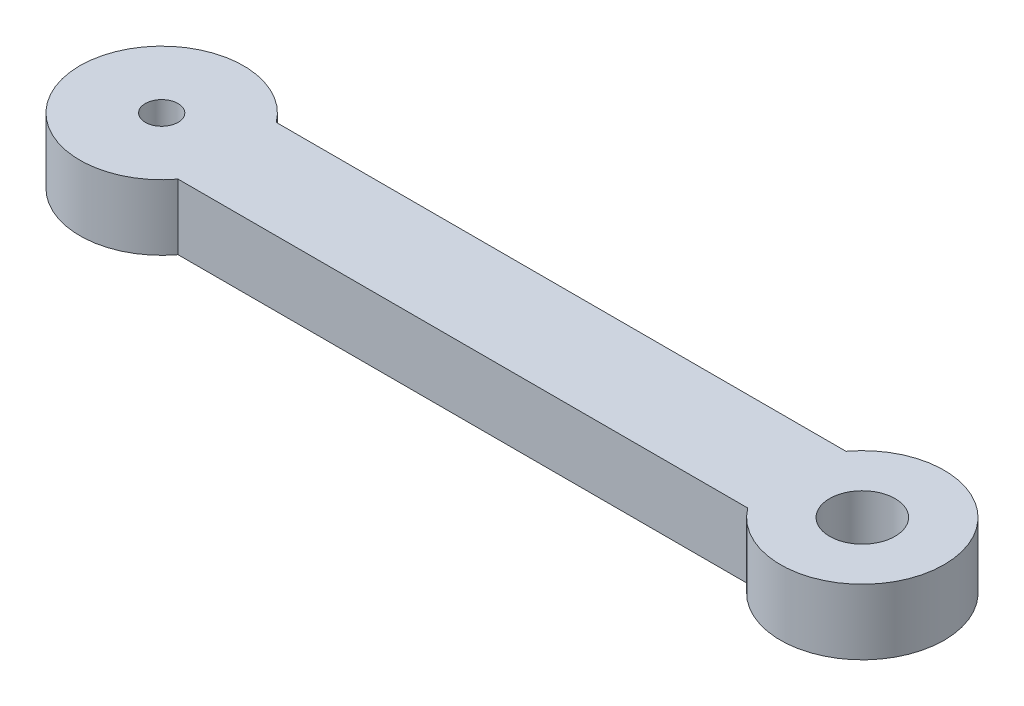
ISO-10303-21;
HEADER;
FILE_DESCRIPTION(('STEP AP214'),'2;1');
FILE_NAME('part.step','',(''),(''),'','','');
FILE_SCHEMA(('AUTOMOTIVE_DESIGN { 1 0 10303 214 1 1 1 1 }'));
ENDSEC;
DATA;
#1=APPLICATION_CONTEXT('core data for automotive mechanical design processes');
#2=APPLICATION_PROTOCOL_DEFINITION('international standard','automotive_design',2000,#1);
#3=PRODUCT_CONTEXT('',#1,'mechanical');
#4=PRODUCT('Part','Part','',(#3));
#5=PRODUCT_RELATED_PRODUCT_CATEGORY('part','',(#4));
#6=PRODUCT_DEFINITION_FORMATION('','',#4);
#7=PRODUCT_DEFINITION_CONTEXT('part definition',#1,'design');
#8=PRODUCT_DEFINITION('design','',#6,#7);
#9=PRODUCT_DEFINITION_SHAPE('','',#8);
#10=(LENGTH_UNIT() NAMED_UNIT(*) SI_UNIT(.MILLI.,.METRE.));
#11=(NAMED_UNIT(*) PLANE_ANGLE_UNIT() SI_UNIT($,.RADIAN.));
#12=(NAMED_UNIT(*) SI_UNIT($,.STERADIAN.) SOLID_ANGLE_UNIT());
#13=UNCERTAINTY_MEASURE_WITH_UNIT(LENGTH_MEASURE(1.E-05),#10,'distance_accuracy_value','');
#14=(GEOMETRIC_REPRESENTATION_CONTEXT(3) GLOBAL_UNCERTAINTY_ASSIGNED_CONTEXT((#13)) GLOBAL_UNIT_ASSIGNED_CONTEXT((#10,
#11,#12)) REPRESENTATION_CONTEXT('',''));
#15=CARTESIAN_POINT('',(0.,0.,0.));
#16=DIRECTION('',(0.,0.,1.));
#17=DIRECTION('',(1.,0.,0.));
#18=AXIS2_PLACEMENT_3D('',#15,#16,#17);
#19=CARTESIAN_POINT('',(-10.7,2.,0.));
#20=DIRECTION('',(0.,1.,0.));
#21=DIRECTION('',(0.,0.,1.));
#22=AXIS2_PLACEMENT_3D('',#19,#20,#21);
#23=PLANE('',#22);
#24=CARTESIAN_POINT('',(-10.7,2.,0.));
#25=DIRECTION('',(0.,1.,0.));
#26=DIRECTION('',(0.,0.,1.));
#27=AXIS2_PLACEMENT_3D('',#24,#25,#26);
#28=CIRCLE('',#27,0.500000000000001);
#29=CARTESIAN_POINT('',(-10.7,2.,0.500000000000001));
#30=VERTEX_POINT('',#29);
#31=EDGE_CURVE('E103',#30,#30,#28,.T.);
#32=ORIENTED_EDGE('',*,*,#31,.F.);
#33=EDGE_LOOP('',(#32));
#34=FACE_BOUND('',#33,.T.);
#35=CARTESIAN_POINT('',(-10.7,2.,0.));
#36=DIRECTION('',(0.,1.,0.));
#37=DIRECTION('',(0.,0.,1.));
#38=AXIS2_PLACEMENT_3D('',#35,#36,#37);
#39=CIRCLE('',#38,2.5);
#40=CARTESIAN_POINT('',(-8.7,2.,-1.5));
#41=VERTEX_POINT('',#40);
#42=CARTESIAN_POINT('',(-8.7,2.,1.5));
#43=VERTEX_POINT('',#42);
#44=EDGE_CURVE('E88',#41,#43,#39,.T.);
#45=ORIENTED_EDGE('',*,*,#44,.T.);
#46=DIRECTION('',(1.,0.,0.));
#47=VECTOR('',#46,1.);
#48=CARTESIAN_POINT('',(-8.7,2.,1.5));
#49=LINE('',#48,#47);
#50=CARTESIAN_POINT('',(8.7,2.,1.5));
#51=VERTEX_POINT('',#50);
#52=EDGE_CURVE('E83',#43,#51,#49,.T.);
#53=ORIENTED_EDGE('',*,*,#52,.T.);
#54=CARTESIAN_POINT('',(10.7,2.,0.));
#55=DIRECTION('',(0.,1.,0.));
#56=DIRECTION('',(0.,0.,1.));
#57=AXIS2_PLACEMENT_3D('',#54,#55,#56);
#58=CIRCLE('',#57,2.5);
#59=CARTESIAN_POINT('',(8.7,2.,-1.5));
#60=VERTEX_POINT('',#59);
#61=EDGE_CURVE('E86',#51,#60,#58,.T.);
#62=ORIENTED_EDGE('',*,*,#61,.T.);
#63=DIRECTION('',(-1.,0.,0.));
#64=VECTOR('',#63,1.);
#65=CARTESIAN_POINT('',(-8.7,2.,-1.5));
#66=LINE('',#65,#64);
#67=EDGE_CURVE('E53',#60,#41,#66,.T.);
#68=ORIENTED_EDGE('',*,*,#67,.T.);
#69=EDGE_LOOP('',(#45,#53,#62,#68));
#70=FACE_BOUND('',#69,.T.);
#71=CARTESIAN_POINT('',(10.7,2.,0.));
#72=DIRECTION('',(0.,1.,0.));
#73=DIRECTION('',(0.,0.,1.));
#74=AXIS2_PLACEMENT_3D('',#71,#72,#73);
#75=CIRCLE('',#74,1.);
#76=CARTESIAN_POINT('',(10.7,2.,1.));
#77=VERTEX_POINT('',#76);
#78=EDGE_CURVE('E118',#77,#77,#75,.T.);
#79=ORIENTED_EDGE('',*,*,#78,.F.);
#80=EDGE_LOOP('',(#79));
#81=FACE_BOUND('',#80,.T.);
#82=ADVANCED_FACE('F36',(#34,#70,#81),#23,.T.);
#83=CARTESIAN_POINT('',(-10.7,0.,0.));
#84=DIRECTION('',(0.,1.,0.));
#85=DIRECTION('',(0.,0.,1.));
#86=AXIS2_PLACEMENT_3D('',#83,#84,#85);
#87=PLANE('',#86);
#88=CARTESIAN_POINT('',(-10.7,0.,0.));
#89=DIRECTION('',(0.,1.,0.));
#90=DIRECTION('',(0.,0.,1.));
#91=AXIS2_PLACEMENT_3D('',#88,#89,#90);
#92=CIRCLE('',#91,2.5);
#93=CARTESIAN_POINT('',(-8.7,0.,-1.5));
#94=VERTEX_POINT('',#93);
#95=CARTESIAN_POINT('',(-8.7,0.,1.5));
#96=VERTEX_POINT('',#95);
#97=EDGE_CURVE('E100',#94,#96,#92,.T.);
#98=ORIENTED_EDGE('',*,*,#97,.F.);
#99=DIRECTION('',(-1.,0.,0.));
#100=VECTOR('',#99,1.);
#101=CARTESIAN_POINT('',(-8.7,0.,-1.5));
#102=LINE('',#101,#100);
#103=CARTESIAN_POINT('',(8.7,0.,-1.5));
#104=VERTEX_POINT('',#103);
#105=EDGE_CURVE('E76',#104,#94,#102,.T.);
#106=ORIENTED_EDGE('',*,*,#105,.F.);
#107=CARTESIAN_POINT('',(10.7,0.,0.));
#108=DIRECTION('',(0.,1.,0.));
#109=DIRECTION('',(0.,0.,1.));
#110=AXIS2_PLACEMENT_3D('',#107,#108,#109);
#111=CIRCLE('',#110,2.5);
#112=CARTESIAN_POINT('',(8.7,0.,1.5));
#113=VERTEX_POINT('',#112);
#114=EDGE_CURVE('E70',#113,#104,#111,.T.);
#115=ORIENTED_EDGE('',*,*,#114,.F.);
#116=DIRECTION('',(1.,0.,0.));
#117=VECTOR('',#116,1.);
#118=CARTESIAN_POINT('',(-8.7,0.,1.5));
#119=LINE('',#118,#117);
#120=EDGE_CURVE('E92',#96,#113,#119,.T.);
#121=ORIENTED_EDGE('',*,*,#120,.F.);
#122=EDGE_LOOP('',(#98,#106,#115,#121));
#123=FACE_BOUND('',#122,.T.);
#124=CARTESIAN_POINT('',(-10.7,0.,0.));
#125=DIRECTION('',(0.,1.,0.));
#126=DIRECTION('',(0.,0.,1.));
#127=AXIS2_PLACEMENT_3D('',#124,#125,#126);
#128=CIRCLE('',#127,0.500000000000001);
#129=CARTESIAN_POINT('',(-10.7,0.,0.500000000000001));
#130=VERTEX_POINT('',#129);
#131=EDGE_CURVE('E115',#130,#130,#128,.T.);
#132=ORIENTED_EDGE('',*,*,#131,.T.);
#133=EDGE_LOOP('',(#132));
#134=FACE_BOUND('',#133,.T.);
#135=CARTESIAN_POINT('',(10.7,0.,0.));
#136=DIRECTION('',(0.,1.,0.));
#137=DIRECTION('',(0.,0.,1.));
#138=AXIS2_PLACEMENT_3D('',#135,#136,#137);
#139=CIRCLE('',#138,1.);
#140=CARTESIAN_POINT('',(10.7,0.,1.));
#141=VERTEX_POINT('',#140);
#142=EDGE_CURVE('E121',#141,#141,#139,.T.);
#143=ORIENTED_EDGE('',*,*,#142,.T.);
#144=EDGE_LOOP('',(#143));
#145=FACE_BOUND('',#144,.T.);
#146=ADVANCED_FACE('F111',(#123,#134,#145),#87,.F.);
#147=CARTESIAN_POINT('',(-10.7,2.,0.));
#148=DIRECTION('',(0.,-1.,0.));
#149=DIRECTION('',(0.,0.,-1.));
#150=AXIS2_PLACEMENT_3D('',#147,#148,#149);
#151=CYLINDRICAL_SURFACE('',#150,2.5);
#152=ORIENTED_EDGE('',*,*,#97,.T.);
#153=DIRECTION('',(0.,-1.,0.));
#154=VECTOR('',#153,1.);
#155=CARTESIAN_POINT('',(-8.7,2.,1.5));
#156=LINE('',#155,#154);
#157=EDGE_CURVE('E11',#43,#96,#156,.T.);
#158=ORIENTED_EDGE('',*,*,#157,.F.);
#159=ORIENTED_EDGE('',*,*,#44,.F.);
#160=DIRECTION('',(0.,-1.,0.));
#161=VECTOR('',#160,1.);
#162=CARTESIAN_POINT('',(-8.7,2.,-1.5));
#163=LINE('',#162,#161);
#164=EDGE_CURVE('E96',#41,#94,#163,.T.);
#165=ORIENTED_EDGE('',*,*,#164,.T.);
#166=EDGE_LOOP('',(#152,#158,#159,#165));
#167=FACE_BOUND('',#166,.T.);
#168=ADVANCED_FACE('F38',(#167),#151,.T.);
#169=CARTESIAN_POINT('',(-8.7,2.,1.5));
#170=DIRECTION('',(0.,0.,-1.));
#171=DIRECTION('',(-1.,0.,0.));
#172=AXIS2_PLACEMENT_3D('',#169,#170,#171);
#173=PLANE('',#172);
#174=ORIENTED_EDGE('',*,*,#120,.T.);
#175=DIRECTION('',(0.,-1.,0.));
#176=VECTOR('',#175,1.);
#177=CARTESIAN_POINT('',(8.7,2.,1.5));
#178=LINE('',#177,#176);
#179=EDGE_CURVE('E45',#51,#113,#178,.T.);
#180=ORIENTED_EDGE('',*,*,#179,.F.);
#181=ORIENTED_EDGE('',*,*,#52,.F.);
#182=ORIENTED_EDGE('',*,*,#157,.T.);
#183=EDGE_LOOP('',(#174,#180,#181,#182));
#184=FACE_BOUND('',#183,.T.);
#185=ADVANCED_FACE('F91',(#184),#173,.F.);
#186=CARTESIAN_POINT('',(10.7,2.,0.));
#187=DIRECTION('',(0.,-1.,0.));
#188=DIRECTION('',(0.,0.,-1.));
#189=AXIS2_PLACEMENT_3D('',#186,#187,#188);
#190=CYLINDRICAL_SURFACE('',#189,2.5);
#191=ORIENTED_EDGE('',*,*,#114,.T.);
#192=DIRECTION('',(0.,-1.,0.));
#193=VECTOR('',#192,1.);
#194=CARTESIAN_POINT('',(8.7,2.,-1.5));
#195=LINE('',#194,#193);
#196=EDGE_CURVE('E93',#60,#104,#195,.T.);
#197=ORIENTED_EDGE('',*,*,#196,.F.);
#198=ORIENTED_EDGE('',*,*,#61,.F.);
#199=ORIENTED_EDGE('',*,*,#179,.T.);
#200=EDGE_LOOP('',(#191,#197,#198,#199));
#201=FACE_BOUND('',#200,.T.);
#202=ADVANCED_FACE('F94',(#201),#190,.T.);
#203=CARTESIAN_POINT('',(-8.7,2.,-1.5));
#204=DIRECTION('',(0.,0.,1.));
#205=DIRECTION('',(1.,0.,0.));
#206=AXIS2_PLACEMENT_3D('',#203,#204,#205);
#207=PLANE('',#206);
#208=ORIENTED_EDGE('',*,*,#105,.T.);
#209=ORIENTED_EDGE('',*,*,#164,.F.);
#210=ORIENTED_EDGE('',*,*,#67,.F.);
#211=ORIENTED_EDGE('',*,*,#196,.T.);
#212=EDGE_LOOP('',(#208,#209,#210,#211));
#213=FACE_BOUND('',#212,.T.);
#214=ADVANCED_FACE('F108',(#213),#207,.F.);
#215=CARTESIAN_POINT('',(-10.7,2.,0.));
#216=DIRECTION('',(0.,-1.,0.));
#217=DIRECTION('',(0.,0.,-1.));
#218=AXIS2_PLACEMENT_3D('',#215,#216,#217);
#219=CYLINDRICAL_SURFACE('',#218,0.500000000000001);
#220=ORIENTED_EDGE('',*,*,#31,.T.);
#221=EDGE_LOOP('',(#220));
#222=FACE_BOUND('',#221,.T.);
#223=ORIENTED_EDGE('',*,*,#131,.F.);
#224=EDGE_LOOP('',(#223));
#225=FACE_BOUND('',#224,.T.);
#226=ADVANCED_FACE('F138',(#222,#225),#219,.F.);
#227=CARTESIAN_POINT('',(10.7,2.,0.));
#228=DIRECTION('',(0.,-1.,0.));
#229=DIRECTION('',(0.,0.,-1.));
#230=AXIS2_PLACEMENT_3D('',#227,#228,#229);
#231=CYLINDRICAL_SURFACE('',#230,1.);
#232=ORIENTED_EDGE('',*,*,#78,.T.);
#233=EDGE_LOOP('',(#232));
#234=FACE_BOUND('',#233,.T.);
#235=ORIENTED_EDGE('',*,*,#142,.F.);
#236=EDGE_LOOP('',(#235));
#237=FACE_BOUND('',#236,.T.);
#238=ADVANCED_FACE('F127',(#234,#237),#231,.F.);
#239=CLOSED_SHELL('',(#82,#146,#168,#185,#202,#214,#226,#238));
#240=MANIFOLD_SOLID_BREP('B2',#239);
#241=ADVANCED_BREP_SHAPE_REPRESENTATION('',(#18,#240),#14);
#242=SHAPE_DEFINITION_REPRESENTATION(#9,#241);
ENDSEC;
END-ISO-10303-21;
